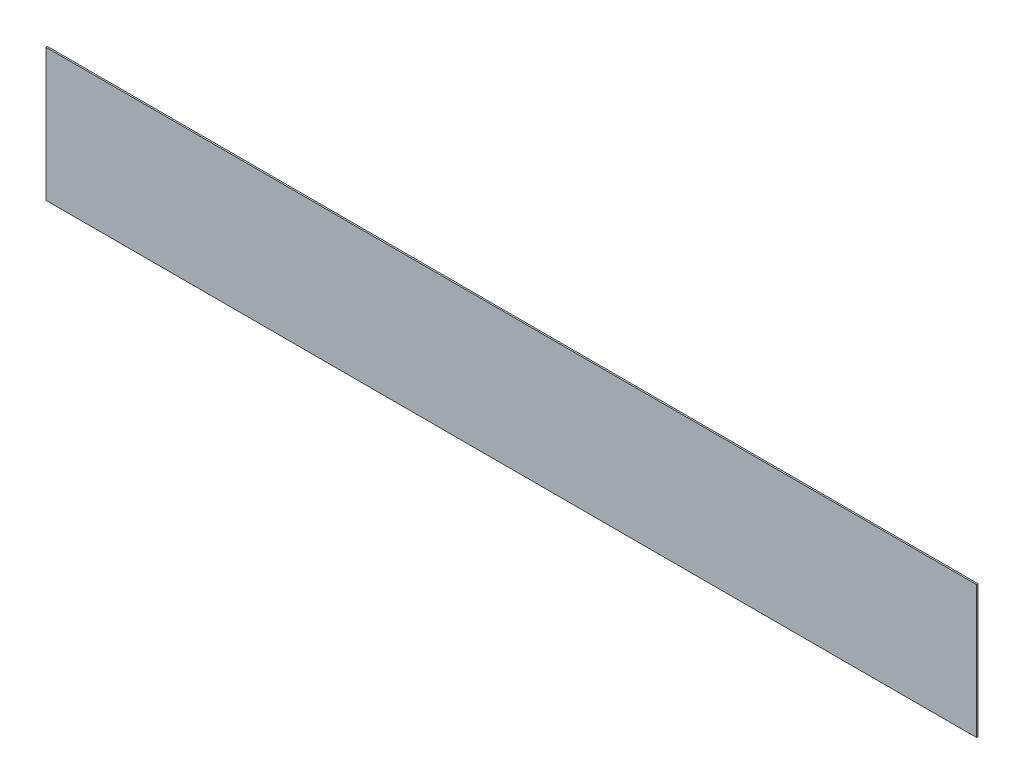
ISO-10303-21;
HEADER;
FILE_DESCRIPTION(('STEP AP214'),'2;1');
FILE_NAME('part.step','',(''),(''),'','','');
FILE_SCHEMA(('AUTOMOTIVE_DESIGN { 1 0 10303 214 1 1 1 1 }'));
ENDSEC;
DATA;
#1=APPLICATION_CONTEXT('core data for automotive mechanical design processes');
#2=APPLICATION_PROTOCOL_DEFINITION('international standard','automotive_design',2000,#1);
#3=PRODUCT_CONTEXT('',#1,'mechanical');
#4=PRODUCT('Part','Part','',(#3));
#5=PRODUCT_RELATED_PRODUCT_CATEGORY('part','',(#4));
#6=PRODUCT_DEFINITION_FORMATION('','',#4);
#7=PRODUCT_DEFINITION_CONTEXT('part definition',#1,'design');
#8=PRODUCT_DEFINITION('design','',#6,#7);
#9=PRODUCT_DEFINITION_SHAPE('','',#8);
#10=(LENGTH_UNIT() NAMED_UNIT(*) SI_UNIT(.MILLI.,.METRE.));
#11=(NAMED_UNIT(*) PLANE_ANGLE_UNIT() SI_UNIT($,.RADIAN.));
#12=(NAMED_UNIT(*) SI_UNIT($,.STERADIAN.) SOLID_ANGLE_UNIT());
#13=UNCERTAINTY_MEASURE_WITH_UNIT(LENGTH_MEASURE(1.E-05),#10,'distance_accuracy_value','');
#14=(GEOMETRIC_REPRESENTATION_CONTEXT(3) GLOBAL_UNCERTAINTY_ASSIGNED_CONTEXT((#13)) GLOBAL_UNIT_ASSIGNED_CONTEXT((#10,
#11,#12)) REPRESENTATION_CONTEXT('',''));
#15=CARTESIAN_POINT('',(0.,0.,0.));
#16=DIRECTION('',(0.,0.,1.));
#17=DIRECTION('',(1.,0.,0.));
#18=AXIS2_PLACEMENT_3D('',#15,#16,#17);
#19=CARTESIAN_POINT('',(0.,0.,1.));
#20=DIRECTION('',(1.,0.,0.));
#21=DIRECTION('',(0.,0.,-1.));
#22=AXIS2_PLACEMENT_3D('',#19,#20,#21);
#23=PLANE('',#22);
#24=DIRECTION('',(0.,-1.,0.));
#25=VECTOR('',#24,1.);
#26=CARTESIAN_POINT('',(0.,0.,0.));
#27=LINE('',#26,#25);
#28=CARTESIAN_POINT('',(0.,88.,0.));
#29=VERTEX_POINT('',#28);
#30=CARTESIAN_POINT('',(0.,0.,0.));
#31=VERTEX_POINT('',#30);
#32=EDGE_CURVE('E102',#29,#31,#27,.T.);
#33=ORIENTED_EDGE('',*,*,#32,.T.);
#34=DIRECTION('',(0.,0.,-1.));
#35=VECTOR('',#34,1.);
#36=CARTESIAN_POINT('',(0.,0.,1.));
#37=LINE('',#36,#35);
#38=CARTESIAN_POINT('',(0.,0.,1.));
#39=VERTEX_POINT('',#38);
#40=EDGE_CURVE('E11',#39,#31,#37,.T.);
#41=ORIENTED_EDGE('',*,*,#40,.F.);
#42=DIRECTION('',(0.,-1.,0.));
#43=VECTOR('',#42,1.);
#44=CARTESIAN_POINT('',(0.,0.,1.));
#45=LINE('',#44,#43);
#46=CARTESIAN_POINT('',(0.,88.,1.));
#47=VERTEX_POINT('',#46);
#48=EDGE_CURVE('E90',#47,#39,#45,.T.);
#49=ORIENTED_EDGE('',*,*,#48,.F.);
#50=DIRECTION('',(0.,0.,-1.));
#51=VECTOR('',#50,1.);
#52=CARTESIAN_POINT('',(0.,88.,1.));
#53=LINE('',#52,#51);
#54=EDGE_CURVE('E98',#47,#29,#53,.T.);
#55=ORIENTED_EDGE('',*,*,#54,.T.);
#56=EDGE_LOOP('',(#33,#41,#49,#55));
#57=FACE_BOUND('',#56,.T.);
#58=ADVANCED_FACE('F39',(#57),#23,.F.);
#59=CARTESIAN_POINT('',(0.,0.,1.));
#60=DIRECTION('',(0.,1.,0.));
#61=DIRECTION('',(0.,0.,1.));
#62=AXIS2_PLACEMENT_3D('',#59,#60,#61);
#63=PLANE('',#62);
#64=DIRECTION('',(1.,0.,0.));
#65=VECTOR('',#64,1.);
#66=CARTESIAN_POINT('',(0.,0.,0.));
#67=LINE('',#66,#65);
#68=CARTESIAN_POINT('',(618.,0.,0.));
#69=VERTEX_POINT('',#68);
#70=EDGE_CURVE('E94',#31,#69,#67,.T.);
#71=ORIENTED_EDGE('',*,*,#70,.T.);
#72=DIRECTION('',(0.,0.,-1.));
#73=VECTOR('',#72,1.);
#74=CARTESIAN_POINT('',(618.,0.,1.));
#75=LINE('',#74,#73);
#76=CARTESIAN_POINT('',(618.,0.,1.));
#77=VERTEX_POINT('',#76);
#78=EDGE_CURVE('E47',#77,#69,#75,.T.);
#79=ORIENTED_EDGE('',*,*,#78,.F.);
#80=DIRECTION('',(1.,0.,0.));
#81=VECTOR('',#80,1.);
#82=CARTESIAN_POINT('',(0.,0.,1.));
#83=LINE('',#82,#81);
#84=EDGE_CURVE('E85',#39,#77,#83,.T.);
#85=ORIENTED_EDGE('',*,*,#84,.F.);
#86=ORIENTED_EDGE('',*,*,#40,.T.);
#87=EDGE_LOOP('',(#71,#79,#85,#86));
#88=FACE_BOUND('',#87,.T.);
#89=ADVANCED_FACE('F93',(#88),#63,.F.);
#90=CARTESIAN_POINT('',(618.,0.,1.));
#91=DIRECTION('',(-1.,0.,0.));
#92=DIRECTION('',(0.,0.,1.));
#93=AXIS2_PLACEMENT_3D('',#90,#91,#92);
#94=PLANE('',#93);
#95=DIRECTION('',(0.,1.,0.));
#96=VECTOR('',#95,1.);
#97=CARTESIAN_POINT('',(618.,0.,0.));
#98=LINE('',#97,#96);
#99=CARTESIAN_POINT('',(618.,88.,0.));
#100=VERTEX_POINT('',#99);
#101=EDGE_CURVE('E72',#69,#100,#98,.T.);
#102=ORIENTED_EDGE('',*,*,#101,.T.);
#103=DIRECTION('',(0.,0.,-1.));
#104=VECTOR('',#103,1.);
#105=CARTESIAN_POINT('',(618.,88.,1.));
#106=LINE('',#105,#104);
#107=CARTESIAN_POINT('',(618.,88.,1.));
#108=VERTEX_POINT('',#107);
#109=EDGE_CURVE('E95',#108,#100,#106,.T.);
#110=ORIENTED_EDGE('',*,*,#109,.F.);
#111=DIRECTION('',(0.,1.,0.));
#112=VECTOR('',#111,1.);
#113=CARTESIAN_POINT('',(618.,0.,1.));
#114=LINE('',#113,#112);
#115=EDGE_CURVE('E88',#77,#108,#114,.T.);
#116=ORIENTED_EDGE('',*,*,#115,.F.);
#117=ORIENTED_EDGE('',*,*,#78,.T.);
#118=EDGE_LOOP('',(#102,#110,#116,#117));
#119=FACE_BOUND('',#118,.T.);
#120=ADVANCED_FACE('F96',(#119),#94,.F.);
#121=CARTESIAN_POINT('',(0.,88.,1.));
#122=DIRECTION('',(0.,-1.,0.));
#123=DIRECTION('',(0.,0.,-1.));
#124=AXIS2_PLACEMENT_3D('',#121,#122,#123);
#125=PLANE('',#124);
#126=DIRECTION('',(-1.,0.,0.));
#127=VECTOR('',#126,1.);
#128=CARTESIAN_POINT('',(0.,88.,0.));
#129=LINE('',#128,#127);
#130=EDGE_CURVE('E78',#100,#29,#129,.T.);
#131=ORIENTED_EDGE('',*,*,#130,.T.);
#132=ORIENTED_EDGE('',*,*,#54,.F.);
#133=DIRECTION('',(-1.,0.,0.));
#134=VECTOR('',#133,1.);
#135=CARTESIAN_POINT('',(0.,88.,1.));
#136=LINE('',#135,#134);
#137=EDGE_CURVE('E55',#108,#47,#136,.T.);
#138=ORIENTED_EDGE('',*,*,#137,.F.);
#139=ORIENTED_EDGE('',*,*,#109,.T.);
#140=EDGE_LOOP('',(#131,#132,#138,#139));
#141=FACE_BOUND('',#140,.T.);
#142=ADVANCED_FACE('F109',(#141),#125,.F.);
#143=CARTESIAN_POINT('',(0.,0.,1.));
#144=DIRECTION('',(0.,0.,-1.));
#145=DIRECTION('',(-1.,0.,0.));
#146=AXIS2_PLACEMENT_3D('',#143,#144,#145);
#147=PLANE('',#146);
#148=ORIENTED_EDGE('',*,*,#48,.T.);
#149=ORIENTED_EDGE('',*,*,#84,.T.);
#150=ORIENTED_EDGE('',*,*,#115,.T.);
#151=ORIENTED_EDGE('',*,*,#137,.T.);
#152=EDGE_LOOP('',(#148,#149,#150,#151));
#153=FACE_BOUND('',#152,.T.);
#154=ADVANCED_FACE('F86',(#153),#147,.F.);
#155=CARTESIAN_POINT('',(0.,0.,0.));
#156=DIRECTION('',(0.,0.,-1.));
#157=DIRECTION('',(-1.,0.,0.));
#158=AXIS2_PLACEMENT_3D('',#155,#156,#157);
#159=PLANE('',#158);
#160=ORIENTED_EDGE('',*,*,#32,.F.);
#161=ORIENTED_EDGE('',*,*,#130,.F.);
#162=ORIENTED_EDGE('',*,*,#101,.F.);
#163=ORIENTED_EDGE('',*,*,#70,.F.);
#164=EDGE_LOOP('',(#160,#161,#162,#163));
#165=FACE_BOUND('',#164,.T.);
#166=ADVANCED_FACE('F112',(#165),#159,.T.);
#167=CLOSED_SHELL('',(#58,#89,#120,#142,#154,#166));
#168=MANIFOLD_SOLID_BREP('B2',#167);
#169=ADVANCED_BREP_SHAPE_REPRESENTATION('',(#18,#168),#14);
#170=SHAPE_DEFINITION_REPRESENTATION(#9,#169);
ENDSEC;
END-ISO-10303-21;
